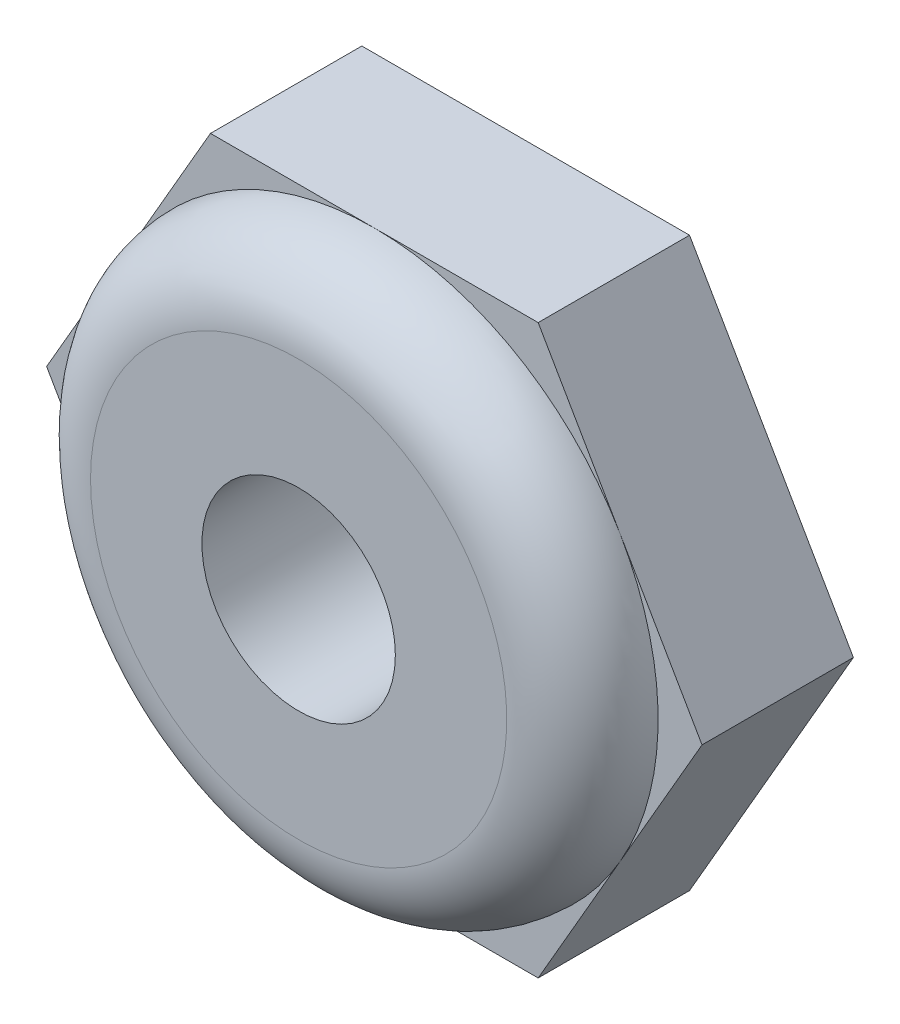
ISO-10303-21;
HEADER;
FILE_DESCRIPTION(('STEP AP214'),'2;1');
FILE_NAME('part.step','',(''),(''),'','','');
FILE_SCHEMA(('AUTOMOTIVE_DESIGN { 1 0 10303 214 1 1 1 1 }'));
ENDSEC;
DATA;
#1=APPLICATION_CONTEXT('core data for automotive mechanical design processes');
#2=APPLICATION_PROTOCOL_DEFINITION('international standard','automotive_design',2000,#1);
#3=PRODUCT_CONTEXT('',#1,'mechanical');
#4=PRODUCT('Part','Part','',(#3));
#5=PRODUCT_RELATED_PRODUCT_CATEGORY('part','',(#4));
#6=PRODUCT_DEFINITION_FORMATION('','',#4);
#7=PRODUCT_DEFINITION_CONTEXT('part definition',#1,'design');
#8=PRODUCT_DEFINITION('design','',#6,#7);
#9=PRODUCT_DEFINITION_SHAPE('','',#8);
#10=(LENGTH_UNIT() NAMED_UNIT(*) SI_UNIT(.MILLI.,.METRE.));
#11=(NAMED_UNIT(*) PLANE_ANGLE_UNIT() SI_UNIT($,.RADIAN.));
#12=(NAMED_UNIT(*) SI_UNIT($,.STERADIAN.) SOLID_ANGLE_UNIT());
#13=UNCERTAINTY_MEASURE_WITH_UNIT(LENGTH_MEASURE(1.E-05),#10,'distance_accuracy_value','');
#14=(GEOMETRIC_REPRESENTATION_CONTEXT(3) GLOBAL_UNCERTAINTY_ASSIGNED_CONTEXT((#13)) GLOBAL_UNIT_ASSIGNED_CONTEXT((#10,
#11,#12)) REPRESENTATION_CONTEXT('',''));
#15=CARTESIAN_POINT('',(0.,0.,0.));
#16=DIRECTION('',(0.,0.,1.));
#17=DIRECTION('',(1.,0.,0.));
#18=AXIS2_PLACEMENT_3D('',#15,#16,#17);
#19=CARTESIAN_POINT('',(0.,0.,3.175));
#20=DIRECTION('',(0.,0.,1.));
#21=DIRECTION('',(1.,0.,0.));
#22=AXIS2_PLACEMENT_3D('',#19,#20,#21);
#23=PLANE('',#22);
#24=CARTESIAN_POINT('',(0.,0.,3.175));
#25=DIRECTION('',(0.,0.,1.));
#26=DIRECTION('',(1.,0.,0.));
#27=AXIS2_PLACEMENT_3D('',#24,#25,#26);
#28=CIRCLE('',#27,1.35255);
#29=CARTESIAN_POINT('',(1.35255,0.,3.175));
#30=VERTEX_POINT('',#29);
#31=EDGE_CURVE('E143',#30,#30,#28,.T.);
#32=ORIENTED_EDGE('',*,*,#31,.F.);
#33=EDGE_LOOP('',(#32));
#34=FACE_BOUND('',#33,.T.);
#35=CARTESIAN_POINT('',(0.,0.,3.175));
#36=DIRECTION('',(0.,0.,-1.));
#37=DIRECTION('',(-1.,0.,0.));
#38=AXIS2_PLACEMENT_3D('',#35,#36,#37);
#39=CIRCLE('',#38,2.91041666666667);
#40=CARTESIAN_POINT('',(-2.91041666666667,0.,3.175));
#41=VERTEX_POINT('',#40);
#42=EDGE_CURVE('E136',#41,#41,#39,.T.);
#43=ORIENTED_EDGE('',*,*,#42,.F.);
#44=EDGE_LOOP('',(#43));
#45=FACE_BOUND('',#44,.T.);
#46=ADVANCED_FACE('F33',(#34,#45),#23,.T.);
#47=CARTESIAN_POINT('',(0.,0.,0.));
#48=DIRECTION('',(0.,0.,1.));
#49=DIRECTION('',(1.,0.,0.));
#50=AXIS2_PLACEMENT_3D('',#47,#48,#49);
#51=PLANE('',#50);
#52=DIRECTION('',(-0.5,0.866025403784438,0.));
#53=VECTOR('',#52,1.);
#54=CARTESIAN_POINT('',(4.58271776169265,0.,0.));
#55=LINE('',#54,#53);
#56=CARTESIAN_POINT('',(4.58271776169265,0.,0.));
#57=VERTEX_POINT('',#56);
#58=CARTESIAN_POINT('',(2.29135888084633,3.96875,0.));
#59=VERTEX_POINT('',#58);
#60=EDGE_CURVE('E150',#57,#59,#55,.T.);
#61=ORIENTED_EDGE('',*,*,#60,.F.);
#62=DIRECTION('',(0.5,0.866025403784439,0.));
#63=VECTOR('',#62,1.);
#64=CARTESIAN_POINT('',(2.29135888084633,-3.96875,0.));
#65=LINE('',#64,#63);
#66=CARTESIAN_POINT('',(2.29135888084633,-3.96875,0.));
#67=VERTEX_POINT('',#66);
#68=EDGE_CURVE('E164',#67,#57,#65,.T.);
#69=ORIENTED_EDGE('',*,*,#68,.F.);
#70=DIRECTION('',(1.,0.,0.));
#71=VECTOR('',#70,1.);
#72=CARTESIAN_POINT('',(-2.29135888084633,-3.96875,0.));
#73=LINE('',#72,#71);
#74=CARTESIAN_POINT('',(-2.29135888084633,-3.96875,0.));
#75=VERTEX_POINT('',#74);
#76=EDGE_CURVE('E161',#75,#67,#73,.T.);
#77=ORIENTED_EDGE('',*,*,#76,.F.);
#78=DIRECTION('',(0.5,-0.866025403784438,0.));
#79=VECTOR('',#78,1.);
#80=CARTESIAN_POINT('',(-4.58271776169266,0.,0.));
#81=LINE('',#80,#79);
#82=CARTESIAN_POINT('',(-4.58271776169266,0.,0.));
#83=VERTEX_POINT('',#82);
#84=EDGE_CURVE('E158',#83,#75,#81,.T.);
#85=ORIENTED_EDGE('',*,*,#84,.F.);
#86=DIRECTION('',(-0.499999999999999,-0.866025403784439,0.));
#87=VECTOR('',#86,1.);
#88=CARTESIAN_POINT('',(-2.29135888084633,3.96875,0.));
#89=LINE('',#88,#87);
#90=CARTESIAN_POINT('',(-2.29135888084633,3.96875,0.));
#91=VERTEX_POINT('',#90);
#92=EDGE_CURVE('E156',#91,#83,#89,.T.);
#93=ORIENTED_EDGE('',*,*,#92,.F.);
#94=DIRECTION('',(-1.,0.,0.));
#95=VECTOR('',#94,1.);
#96=CARTESIAN_POINT('',(2.29135888084633,3.96875,0.));
#97=LINE('',#96,#95);
#98=EDGE_CURVE('E153',#59,#91,#97,.T.);
#99=ORIENTED_EDGE('',*,*,#98,.F.);
#100=EDGE_LOOP('',(#61,#69,#77,#85,#93,#99));
#101=FACE_BOUND('',#100,.T.);
#102=CARTESIAN_POINT('',(0.,0.,0.));
#103=DIRECTION('',(0.,0.,1.));
#104=DIRECTION('',(1.,0.,0.));
#105=AXIS2_PLACEMENT_3D('',#102,#103,#104);
#106=CIRCLE('',#105,1.35255);
#107=CARTESIAN_POINT('',(1.35255,0.,0.));
#108=VERTEX_POINT('',#107);
#109=EDGE_CURVE('E141',#108,#108,#106,.T.);
#110=ORIENTED_EDGE('',*,*,#109,.T.);
#111=EDGE_LOOP('',(#110));
#112=FACE_BOUND('',#111,.T.);
#113=ADVANCED_FACE('F191',(#101,#112),#51,.F.);
#114=CARTESIAN_POINT('',(4.58271776169265,0.,3.175));
#115=DIRECTION('',(-0.866025403784438,-0.5,0.));
#116=DIRECTION('',(0.5,-0.866025403784439,0.));
#117=AXIS2_PLACEMENT_3D('',#114,#115,#116);
#118=PLANE('',#117);
#119=DIRECTION('',(0.,0.,-1.));
#120=VECTOR('',#119,1.);
#121=CARTESIAN_POINT('',(2.29135888084633,3.96875,3.175));
#122=LINE('',#121,#120);
#123=CARTESIAN_POINT('',(2.29135888084633,3.96875,2.11666666666667));
#124=VERTEX_POINT('',#123);
#125=EDGE_CURVE('E173',#124,#59,#122,.T.);
#126=ORIENTED_EDGE('',*,*,#125,.F.);
#127=DIRECTION('',(0.5,-0.866025403784439,0.));
#128=VECTOR('',#127,1.);
#129=CARTESIAN_POINT('',(4.58271776169265,0.,2.11666666666667));
#130=LINE('',#129,#128);
#131=CARTESIAN_POINT('',(3.43703832126949,1.984375,2.11666666666667));
#132=VERTEX_POINT('',#131);
#133=EDGE_CURVE('E195',#124,#132,#130,.T.);
#134=ORIENTED_EDGE('',*,*,#133,.T.);
#135=CARTESIAN_POINT('',(4.58271776169265,0.,2.11666666666667));
#136=VERTEX_POINT('',#135);
#137=EDGE_CURVE('E196',#132,#136,#130,.T.);
#138=ORIENTED_EDGE('',*,*,#137,.T.);
#139=DIRECTION('',(0.,0.,-1.));
#140=VECTOR('',#139,1.);
#141=CARTESIAN_POINT('',(4.58271776169265,0.,3.175));
#142=LINE('',#141,#140);
#143=EDGE_CURVE('E56',#136,#57,#142,.T.);
#144=ORIENTED_EDGE('',*,*,#143,.T.);
#145=ORIENTED_EDGE('',*,*,#60,.T.);
#146=EDGE_LOOP('',(#126,#134,#138,#144,#145));
#147=FACE_BOUND('',#146,.T.);
#148=ADVANCED_FACE('F35',(#147),#118,.F.);
#149=CARTESIAN_POINT('',(2.29135888084633,3.96875,3.175));
#150=DIRECTION('',(0.,-1.,0.));
#151=DIRECTION('',(0.,0.,-1.));
#152=AXIS2_PLACEMENT_3D('',#149,#150,#151);
#153=PLANE('',#152);
#154=DIRECTION('',(0.,0.,-1.));
#155=VECTOR('',#154,1.);
#156=CARTESIAN_POINT('',(-2.29135888084633,3.96875,3.175));
#157=LINE('',#156,#155);
#158=CARTESIAN_POINT('',(-2.29135888084633,3.96875,2.11666666666667));
#159=VERTEX_POINT('',#158);
#160=EDGE_CURVE('E172',#159,#91,#157,.T.);
#161=ORIENTED_EDGE('',*,*,#160,.F.);
#162=DIRECTION('',(1.,0.,0.));
#163=VECTOR('',#162,1.);
#164=CARTESIAN_POINT('',(2.29135888084633,3.96875,2.11666666666667));
#165=LINE('',#164,#163);
#166=CARTESIAN_POINT('',(0.,3.96875,2.11666666666667));
#167=VERTEX_POINT('',#166);
#168=EDGE_CURVE('E113',#159,#167,#165,.T.);
#169=ORIENTED_EDGE('',*,*,#168,.T.);
#170=EDGE_CURVE('E147',#167,#124,#165,.T.);
#171=ORIENTED_EDGE('',*,*,#170,.T.);
#172=ORIENTED_EDGE('',*,*,#125,.T.);
#173=ORIENTED_EDGE('',*,*,#98,.T.);
#174=EDGE_LOOP('',(#161,#169,#171,#172,#173));
#175=FACE_BOUND('',#174,.T.);
#176=ADVANCED_FACE('F205',(#175),#153,.F.);
#177=CARTESIAN_POINT('',(-2.29135888084633,3.96875,3.175));
#178=DIRECTION('',(0.866025403784439,-0.499999999999999,0.));
#179=DIRECTION('',(0.499999999999999,0.866025403784439,0.));
#180=AXIS2_PLACEMENT_3D('',#177,#178,#179);
#181=PLANE('',#180);
#182=DIRECTION('',(0.,0.,-1.));
#183=VECTOR('',#182,1.);
#184=CARTESIAN_POINT('',(-4.58271776169266,0.,3.175));
#185=LINE('',#184,#183);
#186=CARTESIAN_POINT('',(-4.58271776169266,0.,2.11666666666667));
#187=VERTEX_POINT('',#186);
#188=EDGE_CURVE('E140',#187,#83,#185,.T.);
#189=ORIENTED_EDGE('',*,*,#188,.F.);
#190=DIRECTION('',(0.499999999999999,0.866025403784439,0.));
#191=VECTOR('',#190,1.);
#192=CARTESIAN_POINT('',(-2.29135888084633,3.96875,2.11666666666667));
#193=LINE('',#192,#191);
#194=CARTESIAN_POINT('',(-3.43703832126949,1.984375,2.11666666666667));
#195=VERTEX_POINT('',#194);
#196=EDGE_CURVE('E117',#187,#195,#193,.T.);
#197=ORIENTED_EDGE('',*,*,#196,.T.);
#198=EDGE_CURVE('E107',#195,#159,#193,.T.);
#199=ORIENTED_EDGE('',*,*,#198,.T.);
#200=ORIENTED_EDGE('',*,*,#160,.T.);
#201=ORIENTED_EDGE('',*,*,#92,.T.);
#202=EDGE_LOOP('',(#189,#197,#199,#200,#201));
#203=FACE_BOUND('',#202,.T.);
#204=ADVANCED_FACE('F138',(#203),#181,.F.);
#205=CARTESIAN_POINT('',(-4.58271776169266,0.,3.175));
#206=DIRECTION('',(0.866025403784438,0.5,0.));
#207=DIRECTION('',(-0.5,0.866025403784438,0.));
#208=AXIS2_PLACEMENT_3D('',#205,#206,#207);
#209=PLANE('',#208);
#210=DIRECTION('',(0.,0.,-1.));
#211=VECTOR('',#210,1.);
#212=CARTESIAN_POINT('',(-2.29135888084633,-3.96875,3.175));
#213=LINE('',#212,#211);
#214=CARTESIAN_POINT('',(-2.29135888084633,-3.96875,2.11666666666667));
#215=VERTEX_POINT('',#214);
#216=EDGE_CURVE('E169',#215,#75,#213,.T.);
#217=ORIENTED_EDGE('',*,*,#216,.F.);
#218=DIRECTION('',(-0.5,0.866025403784438,0.));
#219=VECTOR('',#218,1.);
#220=CARTESIAN_POINT('',(-4.58271776169266,0.,2.11666666666667));
#221=LINE('',#220,#219);
#222=CARTESIAN_POINT('',(-3.43703832126949,-1.984375,2.11666666666667));
#223=VERTEX_POINT('',#222);
#224=EDGE_CURVE('E200',#215,#223,#221,.T.);
#225=ORIENTED_EDGE('',*,*,#224,.T.);
#226=EDGE_CURVE('E118',#223,#187,#221,.T.);
#227=ORIENTED_EDGE('',*,*,#226,.T.);
#228=ORIENTED_EDGE('',*,*,#188,.T.);
#229=ORIENTED_EDGE('',*,*,#84,.T.);
#230=EDGE_LOOP('',(#217,#225,#227,#228,#229));
#231=FACE_BOUND('',#230,.T.);
#232=ADVANCED_FACE('F206',(#231),#209,.F.);
#233=CARTESIAN_POINT('',(-2.29135888084633,-3.96875,3.175));
#234=DIRECTION('',(0.,1.,0.));
#235=DIRECTION('',(-1.,0.,0.));
#236=AXIS2_PLACEMENT_3D('',#233,#234,#235);
#237=PLANE('',#236);
#238=DIRECTION('',(0.,0.,-1.));
#239=VECTOR('',#238,1.);
#240=CARTESIAN_POINT('',(2.29135888084633,-3.96875,3.175));
#241=LINE('',#240,#239);
#242=CARTESIAN_POINT('',(2.29135888084633,-3.96875,2.11666666666667));
#243=VERTEX_POINT('',#242);
#244=EDGE_CURVE('E167',#243,#67,#241,.T.);
#245=ORIENTED_EDGE('',*,*,#244,.F.);
#246=DIRECTION('',(-1.,0.,0.));
#247=VECTOR('',#246,1.);
#248=CARTESIAN_POINT('',(-2.29135888084633,-3.96875,2.11666666666667));
#249=LINE('',#248,#247);
#250=CARTESIAN_POINT('',(0.,-3.96875,2.11666666666667));
#251=VERTEX_POINT('',#250);
#252=EDGE_CURVE('E48',#243,#251,#249,.T.);
#253=ORIENTED_EDGE('',*,*,#252,.T.);
#254=EDGE_CURVE('E198',#251,#215,#249,.T.);
#255=ORIENTED_EDGE('',*,*,#254,.T.);
#256=ORIENTED_EDGE('',*,*,#216,.T.);
#257=ORIENTED_EDGE('',*,*,#76,.T.);
#258=EDGE_LOOP('',(#245,#253,#255,#256,#257));
#259=FACE_BOUND('',#258,.T.);
#260=ADVANCED_FACE('F183',(#259),#237,.F.);
#261=CARTESIAN_POINT('',(2.29135888084633,-3.96875,3.175));
#262=DIRECTION('',(-0.866025403784439,0.5,0.));
#263=DIRECTION('',(-0.5,-0.866025403784439,0.));
#264=AXIS2_PLACEMENT_3D('',#261,#262,#263);
#265=PLANE('',#264);
#266=ORIENTED_EDGE('',*,*,#143,.F.);
#267=DIRECTION('',(-0.5,-0.866025403784439,0.));
#268=VECTOR('',#267,1.);
#269=CARTESIAN_POINT('',(2.29135888084633,-3.96875,2.11666666666667));
#270=LINE('',#269,#268);
#271=CARTESIAN_POINT('',(3.43703832126949,-1.984375,2.11666666666667));
#272=VERTEX_POINT('',#271);
#273=EDGE_CURVE('E11',#136,#272,#270,.T.);
#274=ORIENTED_EDGE('',*,*,#273,.T.);
#275=EDGE_CURVE('E37',#272,#243,#270,.T.);
#276=ORIENTED_EDGE('',*,*,#275,.T.);
#277=ORIENTED_EDGE('',*,*,#244,.T.);
#278=ORIENTED_EDGE('',*,*,#68,.T.);
#279=EDGE_LOOP('',(#266,#274,#276,#277,#278));
#280=FACE_BOUND('',#279,.T.);
#281=ADVANCED_FACE('F180',(#280),#265,.F.);
#282=CARTESIAN_POINT('',(0.,0.,3.175));
#283=DIRECTION('',(0.,0.,-1.));
#284=DIRECTION('',(-1.,0.,0.));
#285=AXIS2_PLACEMENT_3D('',#282,#283,#284);
#286=CYLINDRICAL_SURFACE('',#285,1.35255);
#287=ORIENTED_EDGE('',*,*,#31,.T.);
#288=EDGE_LOOP('',(#287));
#289=FACE_BOUND('',#288,.T.);
#290=ORIENTED_EDGE('',*,*,#109,.F.);
#291=EDGE_LOOP('',(#290));
#292=FACE_BOUND('',#291,.T.);
#293=ADVANCED_FACE('F225',(#289,#292),#286,.F.);
#294=CARTESIAN_POINT('',(0.,5.953125,2.11666666666667));
#295=DIRECTION('',(0.,0.,-1.));
#296=DIRECTION('',(-1.,0.,0.));
#297=AXIS2_PLACEMENT_3D('',#294,#295,#296);
#298=PLANE('',#297);
#299=ORIENTED_EDGE('',*,*,#226,.F.);
#300=CARTESIAN_POINT('',(0.,0.,2.11666666666667));
#301=DIRECTION('',(0.,0.,-1.));
#302=DIRECTION('',(-1.,0.,0.));
#303=AXIS2_PLACEMENT_3D('',#300,#301,#302);
#304=CIRCLE('',#303,3.96875);
#305=EDGE_CURVE('E122',#223,#195,#304,.T.);
#306=ORIENTED_EDGE('',*,*,#305,.T.);
#307=ORIENTED_EDGE('',*,*,#196,.F.);
#308=EDGE_LOOP('',(#299,#306,#307));
#309=FACE_BOUND('',#308,.T.);
#310=ADVANCED_FACE('F123',(#309),#298,.F.);
#311=EDGE_CURVE('E111',#195,#167,#304,.T.);
#312=ORIENTED_EDGE('',*,*,#311,.T.);
#313=ORIENTED_EDGE('',*,*,#168,.F.);
#314=ORIENTED_EDGE('',*,*,#198,.F.);
#315=EDGE_LOOP('',(#312,#313,#314));
#316=FACE_BOUND('',#315,.T.);
#317=ADVANCED_FACE('F109',(#316),#298,.F.);
#318=EDGE_CURVE('E135',#167,#132,#304,.T.);
#319=ORIENTED_EDGE('',*,*,#318,.T.);
#320=ORIENTED_EDGE('',*,*,#133,.F.);
#321=ORIENTED_EDGE('',*,*,#170,.F.);
#322=EDGE_LOOP('',(#319,#320,#321));
#323=FACE_BOUND('',#322,.T.);
#324=ADVANCED_FACE('F243',(#323),#298,.F.);
#325=ORIENTED_EDGE('',*,*,#254,.F.);
#326=EDGE_CURVE('E128',#251,#223,#304,.T.);
#327=ORIENTED_EDGE('',*,*,#326,.T.);
#328=ORIENTED_EDGE('',*,*,#224,.F.);
#329=EDGE_LOOP('',(#325,#327,#328));
#330=FACE_BOUND('',#329,.T.);
#331=ADVANCED_FACE('F250',(#330),#298,.F.);
#332=EDGE_CURVE('E257',#132,#272,#304,.T.);
#333=ORIENTED_EDGE('',*,*,#332,.T.);
#334=ORIENTED_EDGE('',*,*,#273,.F.);
#335=ORIENTED_EDGE('',*,*,#137,.F.);
#336=EDGE_LOOP('',(#333,#334,#335));
#337=FACE_BOUND('',#336,.T.);
#338=ADVANCED_FACE('F245',(#337),#298,.F.);
#339=ORIENTED_EDGE('',*,*,#275,.F.);
#340=EDGE_CURVE('E258',#272,#251,#304,.T.);
#341=ORIENTED_EDGE('',*,*,#340,.T.);
#342=ORIENTED_EDGE('',*,*,#252,.F.);
#343=EDGE_LOOP('',(#339,#341,#342));
#344=FACE_BOUND('',#343,.T.);
#345=ADVANCED_FACE('F237',(#344),#298,.F.);
#346=CARTESIAN_POINT('',(0.,0.,2.11666666666667));
#347=DIRECTION('',(0.,0.,-1.));
#348=DIRECTION('',(-1.,0.,0.));
#349=AXIS2_PLACEMENT_3D('',#346,#347,#348);
#350=TOROIDAL_SURFACE('',#349,2.91041666666667,1.05833333333333);
#351=ORIENTED_EDGE('',*,*,#311,.F.);
#352=ORIENTED_EDGE('',*,*,#305,.F.);
#353=ORIENTED_EDGE('',*,*,#326,.F.);
#354=ORIENTED_EDGE('',*,*,#340,.F.);
#355=ORIENTED_EDGE('',*,*,#332,.F.);
#356=ORIENTED_EDGE('',*,*,#318,.F.);
#357=EDGE_LOOP('',(#351,#352,#353,#354,#355,#356));
#358=FACE_BOUND('',#357,.T.);
#359=ORIENTED_EDGE('',*,*,#42,.T.);
#360=EDGE_LOOP('',(#359));
#361=FACE_BOUND('',#360,.T.);
#362=ADVANCED_FACE('F131',(#358,#361),#350,.T.);
#363=CLOSED_SHELL('',(#46,#113,#148,#176,#204,#232,#260,#281,#293,#310,#317,#324,#331,#338,#345,#362));
#364=MANIFOLD_SOLID_BREP('B2',#363);
#365=ADVANCED_BREP_SHAPE_REPRESENTATION('',(#18,#364),#14);
#366=SHAPE_DEFINITION_REPRESENTATION(#9,#365);
ENDSEC;
END-ISO-10303-21;
